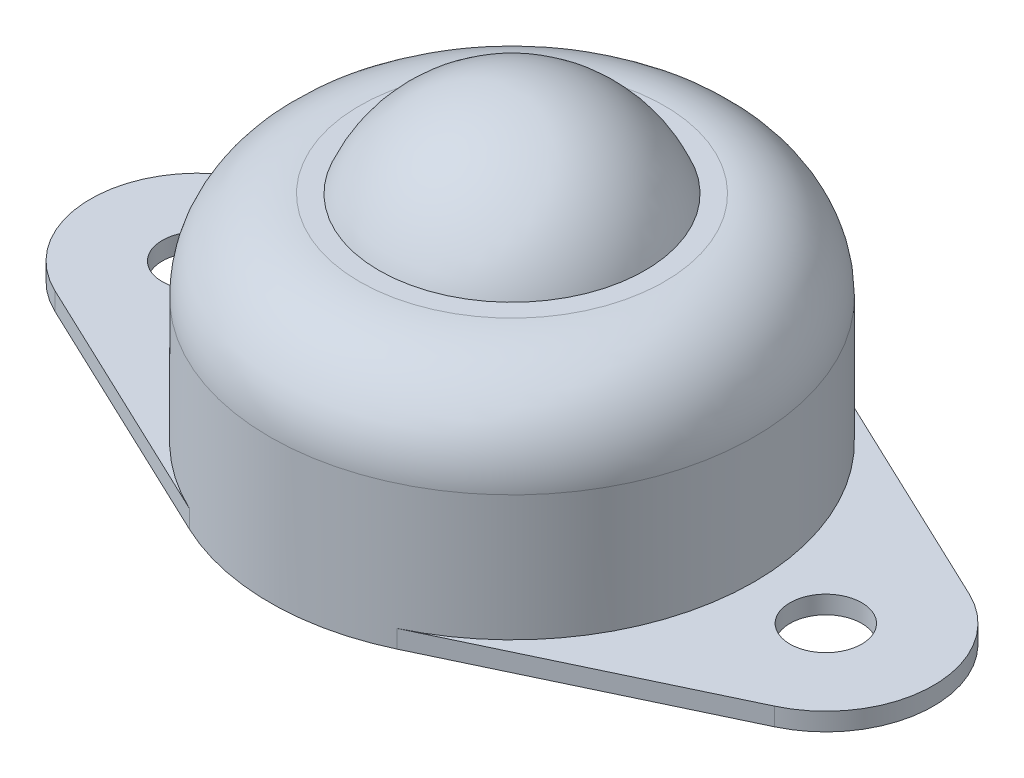
ISO-10303-21;
HEADER;
FILE_DESCRIPTION(('STEP AP214'),'2;1');
FILE_NAME('part.step','',(''),(''),'','','');
FILE_SCHEMA(('AUTOMOTIVE_DESIGN { 1 0 10303 214 1 1 1 1 }'));
ENDSEC;
DATA;
#1=APPLICATION_CONTEXT('core data for automotive mechanical design processes');
#2=APPLICATION_PROTOCOL_DEFINITION('international standard','automotive_design',2000,#1);
#3=PRODUCT_CONTEXT('',#1,'mechanical');
#4=PRODUCT('Part','Part','',(#3));
#5=PRODUCT_RELATED_PRODUCT_CATEGORY('part','',(#4));
#6=PRODUCT_DEFINITION_FORMATION('','',#4);
#7=PRODUCT_DEFINITION_CONTEXT('part definition',#1,'design');
#8=PRODUCT_DEFINITION('design','',#6,#7);
#9=PRODUCT_DEFINITION_SHAPE('','',#8);
#10=(LENGTH_UNIT() NAMED_UNIT(*) SI_UNIT(.MILLI.,.METRE.));
#11=(NAMED_UNIT(*) PLANE_ANGLE_UNIT() SI_UNIT($,.RADIAN.));
#12=(NAMED_UNIT(*) SI_UNIT($,.STERADIAN.) SOLID_ANGLE_UNIT());
#13=UNCERTAINTY_MEASURE_WITH_UNIT(LENGTH_MEASURE(1.E-05),#10,'distance_accuracy_value','');
#14=(GEOMETRIC_REPRESENTATION_CONTEXT(3) GLOBAL_UNCERTAINTY_ASSIGNED_CONTEXT((#13)) GLOBAL_UNIT_ASSIGNED_CONTEXT((#10,
#11,#12)) REPRESENTATION_CONTEXT('',''));
#15=CARTESIAN_POINT('',(0.,0.,0.));
#16=DIRECTION('',(0.,0.,1.));
#17=DIRECTION('',(1.,0.,0.));
#18=AXIS2_PLACEMENT_3D('',#15,#16,#17);
#19=CARTESIAN_POINT('',(-17.5,1.,0.));
#20=DIRECTION('',(0.,1.,0.));
#21=DIRECTION('',(0.,0.,1.));
#22=AXIS2_PLACEMENT_3D('',#19,#20,#21);
#23=PLANE('',#22);
#24=CARTESIAN_POINT('',(17.5,1.,0.));
#25=DIRECTION('',(0.,1.,0.));
#26=DIRECTION('',(0.,0.,1.));
#27=AXIS2_PLACEMENT_3D('',#24,#25,#26);
#28=CIRCLE('',#27,2.);
#29=CARTESIAN_POINT('',(17.5,1.,2.));
#30=VERTEX_POINT('',#29);
#31=EDGE_CURVE('E148',#30,#30,#28,.T.);
#32=ORIENTED_EDGE('',*,*,#31,.F.);
#33=EDGE_LOOP('',(#32));
#34=FACE_BOUND('',#33,.T.);
#35=CARTESIAN_POINT('',(0.,1.,0.));
#36=DIRECTION('',(0.,1.,0.));
#37=DIRECTION('',(0.,0.,1.));
#38=AXIS2_PLACEMENT_3D('',#35,#36,#37);
#39=CIRCLE('',#38,13.5);
#40=CARTESIAN_POINT('',(5.78571428571429,1.,12.1973566892209));
#41=VERTEX_POINT('',#40);
#42=CARTESIAN_POINT('',(5.78571428571428,1.,-12.1973566892209));
#43=VERTEX_POINT('',#42);
#44=EDGE_CURVE('E122',#41,#43,#39,.T.);
#45=ORIENTED_EDGE('',*,*,#44,.F.);
#46=DIRECTION('',(0.903507902905251,0.,-0.428571428571429));
#47=VECTOR('',#46,1.);
#48=CARTESIAN_POINT('',(20.0714285714286,1.,5.4210474174315));
#49=LINE('',#48,#47);
#50=CARTESIAN_POINT('',(20.0714285714286,1.,5.42104741743151));
#51=VERTEX_POINT('',#50);
#52=EDGE_CURVE('E233',#41,#51,#49,.T.);
#53=ORIENTED_EDGE('',*,*,#52,.T.);
#54=CARTESIAN_POINT('',(17.5,1.,0.));
#55=DIRECTION('',(0.,1.,0.));
#56=DIRECTION('',(0.,0.,-1.));
#57=AXIS2_PLACEMENT_3D('',#54,#55,#56);
#58=CIRCLE('',#57,6.);
#59=CARTESIAN_POINT('',(20.0714285714286,1.,-5.42104741743152));
#60=VERTEX_POINT('',#59);
#61=EDGE_CURVE('E124',#51,#60,#58,.T.);
#62=ORIENTED_EDGE('',*,*,#61,.T.);
#63=DIRECTION('',(-0.903507902905252,0.,-0.428571428571428));
#64=VECTOR('',#63,1.);
#65=CARTESIAN_POINT('',(20.0714285714286,1.,-5.42104741743152));
#66=LINE('',#65,#64);
#67=EDGE_CURVE('E119',#60,#43,#66,.T.);
#68=ORIENTED_EDGE('',*,*,#67,.T.);
#69=EDGE_LOOP('',(#45,#53,#62,#68));
#70=FACE_BOUND('',#69,.T.);
#71=ADVANCED_FACE('F44',(#34,#70),#23,.T.);
#72=CARTESIAN_POINT('',(-17.5,1.,0.));
#73=DIRECTION('',(0.,-1.,0.));
#74=DIRECTION('',(0.,0.,-1.));
#75=AXIS2_PLACEMENT_3D('',#72,#73,#74);
#76=CYLINDRICAL_SURFACE('',#75,6.);
#77=CARTESIAN_POINT('',(-17.5,0.,0.));
#78=DIRECTION('',(0.,1.,0.));
#79=DIRECTION('',(0.,0.,1.));
#80=AXIS2_PLACEMENT_3D('',#77,#78,#79);
#81=CIRCLE('',#80,6.);
#82=CARTESIAN_POINT('',(-20.0714285714286,0.,-5.42104741743151));
#83=VERTEX_POINT('',#82);
#84=CARTESIAN_POINT('',(-20.0714285714286,0.,5.42104741743151));
#85=VERTEX_POINT('',#84);
#86=EDGE_CURVE('E140',#83,#85,#81,.T.);
#87=ORIENTED_EDGE('',*,*,#86,.T.);
#88=DIRECTION('',(0.,-1.,0.));
#89=VECTOR('',#88,1.);
#90=CARTESIAN_POINT('',(-20.0714285714286,1.,5.42104741743151));
#91=LINE('',#90,#89);
#92=CARTESIAN_POINT('',(-20.0714285714286,1.,5.42104741743151));
#93=VERTEX_POINT('',#92);
#94=EDGE_CURVE('E153',#93,#85,#91,.T.);
#95=ORIENTED_EDGE('',*,*,#94,.F.);
#96=CARTESIAN_POINT('',(-17.5,1.,0.));
#97=DIRECTION('',(0.,1.,0.));
#98=DIRECTION('',(0.,0.,1.));
#99=AXIS2_PLACEMENT_3D('',#96,#97,#98);
#100=CIRCLE('',#99,6.);
#101=CARTESIAN_POINT('',(-20.0714285714286,1.,-5.42104741743151));
#102=VERTEX_POINT('',#101);
#103=EDGE_CURVE('E223',#102,#93,#100,.T.);
#104=ORIENTED_EDGE('',*,*,#103,.F.);
#105=DIRECTION('',(0.,-1.,0.));
#106=VECTOR('',#105,1.);
#107=CARTESIAN_POINT('',(-20.0714285714286,1.,-5.42104741743151));
#108=LINE('',#107,#106);
#109=EDGE_CURVE('E207',#102,#83,#108,.T.);
#110=ORIENTED_EDGE('',*,*,#109,.T.);
#111=EDGE_LOOP('',(#87,#95,#104,#110));
#112=FACE_BOUND('',#111,.T.);
#113=ADVANCED_FACE('F184',(#112),#76,.T.);
#114=CARTESIAN_POINT('',(-20.0714285714286,1.,5.42104741743151));
#115=DIRECTION('',(0.428571428571428,0.,-0.903507902905251));
#116=DIRECTION('',(-0.903507902905251,0.,-0.428571428571429));
#117=AXIS2_PLACEMENT_3D('',#114,#115,#116);
#118=PLANE('',#117);
#119=DIRECTION('',(0.903507902905251,0.,0.428571428571429));
#120=VECTOR('',#119,1.);
#121=CARTESIAN_POINT('',(-20.0714285714286,0.,5.42104741743151));
#122=LINE('',#121,#120);
#123=CARTESIAN_POINT('',(-5.78571428571429,0.,12.1973566892209));
#124=VERTEX_POINT('',#123);
#125=EDGE_CURVE('E145',#85,#124,#122,.T.);
#126=ORIENTED_EDGE('',*,*,#125,.T.);
#127=DIRECTION('',(0.,-1.,0.));
#128=VECTOR('',#127,1.);
#129=CARTESIAN_POINT('',(-5.78571428571429,1.,12.1973566892209));
#130=LINE('',#129,#128);
#131=CARTESIAN_POINT('',(-5.78571428571429,1.,12.1973566892209));
#132=VERTEX_POINT('',#131);
#133=EDGE_CURVE('E157',#132,#124,#130,.T.);
#134=ORIENTED_EDGE('',*,*,#133,.F.);
#135=DIRECTION('',(0.903507902905251,0.,0.428571428571429));
#136=VECTOR('',#135,1.);
#137=CARTESIAN_POINT('',(-20.0714285714286,1.,5.42104741743151));
#138=LINE('',#137,#136);
#139=EDGE_CURVE('E106',#93,#132,#138,.T.);
#140=ORIENTED_EDGE('',*,*,#139,.F.);
#141=ORIENTED_EDGE('',*,*,#94,.T.);
#142=EDGE_LOOP('',(#126,#134,#140,#141));
#143=FACE_BOUND('',#142,.T.);
#144=ADVANCED_FACE('F192',(#143),#118,.F.);
#145=CARTESIAN_POINT('',(20.0714285714286,1.,5.4210474174315));
#146=DIRECTION('',(-0.428571428571429,0.,-0.903507902905251));
#147=DIRECTION('',(-0.903507902905251,0.,0.428571428571429));
#148=AXIS2_PLACEMENT_3D('',#145,#146,#147);
#149=PLANE('',#148);
#150=DIRECTION('',(0.903507902905251,0.,-0.428571428571429));
#151=VECTOR('',#150,1.);
#152=CARTESIAN_POINT('',(20.0714285714286,0.,5.4210474174315));
#153=LINE('',#152,#151);
#154=CARTESIAN_POINT('',(5.78571428571429,0.,12.1973566892209));
#155=VERTEX_POINT('',#154);
#156=CARTESIAN_POINT('',(20.0714285714286,0.,5.42104741743151));
#157=VERTEX_POINT('',#156);
#158=EDGE_CURVE('E217',#155,#157,#153,.T.);
#159=ORIENTED_EDGE('',*,*,#158,.T.);
#160=DIRECTION('',(0.,-1.,0.));
#161=VECTOR('',#160,1.);
#162=CARTESIAN_POINT('',(20.0714285714286,1.,5.42104741743151));
#163=LINE('',#162,#161);
#164=EDGE_CURVE('E226',#51,#157,#163,.T.);
#165=ORIENTED_EDGE('',*,*,#164,.F.);
#166=ORIENTED_EDGE('',*,*,#52,.F.);
#167=DIRECTION('',(0.,-1.,0.));
#168=VECTOR('',#167,1.);
#169=CARTESIAN_POINT('',(5.78571428571429,1.,12.1973566892209));
#170=LINE('',#169,#168);
#171=EDGE_CURVE('E139',#41,#155,#170,.T.);
#172=ORIENTED_EDGE('',*,*,#171,.T.);
#173=EDGE_LOOP('',(#159,#165,#166,#172));
#174=FACE_BOUND('',#173,.T.);
#175=ADVANCED_FACE('F231',(#174),#149,.F.);
#176=CARTESIAN_POINT('',(17.5,1.,0.));
#177=DIRECTION('',(0.,-1.,0.));
#178=DIRECTION('',(0.,0.,-1.));
#179=AXIS2_PLACEMENT_3D('',#176,#177,#178);
#180=CYLINDRICAL_SURFACE('',#179,6.);
#181=CARTESIAN_POINT('',(17.5,0.,0.));
#182=DIRECTION('',(0.,1.,0.));
#183=DIRECTION('',(0.,0.,-1.));
#184=AXIS2_PLACEMENT_3D('',#181,#182,#183);
#185=CIRCLE('',#184,6.);
#186=CARTESIAN_POINT('',(20.0714285714286,0.,-5.42104741743152));
#187=VERTEX_POINT('',#186);
#188=EDGE_CURVE('E219',#157,#187,#185,.T.);
#189=ORIENTED_EDGE('',*,*,#188,.T.);
#190=DIRECTION('',(0.,-1.,0.));
#191=VECTOR('',#190,1.);
#192=CARTESIAN_POINT('',(20.0714285714286,1.,-5.42104741743152));
#193=LINE('',#192,#191);
#194=EDGE_CURVE('E133',#60,#187,#193,.T.);
#195=ORIENTED_EDGE('',*,*,#194,.F.);
#196=ORIENTED_EDGE('',*,*,#61,.F.);
#197=ORIENTED_EDGE('',*,*,#164,.T.);
#198=EDGE_LOOP('',(#189,#195,#196,#197));
#199=FACE_BOUND('',#198,.T.);
#200=ADVANCED_FACE('F239',(#199),#180,.T.);
#201=CARTESIAN_POINT('',(20.0714285714286,1.,-5.42104741743152));
#202=DIRECTION('',(-0.428571428571428,0.,0.903507902905251));
#203=DIRECTION('',(0.903507902905252,0.,0.428571428571428));
#204=AXIS2_PLACEMENT_3D('',#201,#202,#203);
#205=PLANE('',#204);
#206=DIRECTION('',(-0.903507902905252,0.,-0.428571428571428));
#207=VECTOR('',#206,1.);
#208=CARTESIAN_POINT('',(20.0714285714286,0.,-5.42104741743152));
#209=LINE('',#208,#207);
#210=CARTESIAN_POINT('',(5.78571428571428,0.,-12.1973566892209));
#211=VERTEX_POINT('',#210);
#212=EDGE_CURVE('E132',#187,#211,#209,.T.);
#213=ORIENTED_EDGE('',*,*,#212,.T.);
#214=DIRECTION('',(0.,-1.,0.));
#215=VECTOR('',#214,1.);
#216=CARTESIAN_POINT('',(5.78571428571428,1.,-12.1973566892209));
#217=LINE('',#216,#215);
#218=EDGE_CURVE('E129',#43,#211,#217,.T.);
#219=ORIENTED_EDGE('',*,*,#218,.F.);
#220=ORIENTED_EDGE('',*,*,#67,.F.);
#221=ORIENTED_EDGE('',*,*,#194,.T.);
#222=EDGE_LOOP('',(#213,#219,#220,#221));
#223=FACE_BOUND('',#222,.T.);
#224=ADVANCED_FACE('F130',(#223),#205,.F.);
#225=CARTESIAN_POINT('',(0.,1.,0.));
#226=DIRECTION('',(0.,-1.,0.));
#227=DIRECTION('',(0.,0.,-1.));
#228=AXIS2_PLACEMENT_3D('',#225,#226,#227);
#229=CYLINDRICAL_SURFACE('',#228,13.5);
#230=CARTESIAN_POINT('',(0.,8.,0.));
#231=DIRECTION('',(0.,1.,0.));
#232=DIRECTION('',(0.,0.,1.));
#233=AXIS2_PLACEMENT_3D('',#230,#231,#232);
#234=CIRCLE('',#233,13.5);
#235=CARTESIAN_POINT('',(0.,8.,13.5));
#236=VERTEX_POINT('',#235);
#237=EDGE_CURVE('E11',#236,#236,#234,.F.);
#238=ORIENTED_EDGE('',*,*,#237,.T.);
#239=EDGE_LOOP('',(#238));
#240=FACE_BOUND('',#239,.T.);
#241=CARTESIAN_POINT('',(0.,0.,0.));
#242=DIRECTION('',(0.,1.,0.));
#243=DIRECTION('',(0.,0.,1.));
#244=AXIS2_PLACEMENT_3D('',#241,#242,#243);
#245=CIRCLE('',#244,13.5);
#246=CARTESIAN_POINT('',(-5.78571428571428,0.,-12.1973566892209));
#247=VERTEX_POINT('',#246);
#248=EDGE_CURVE('E91',#211,#247,#245,.T.);
#249=ORIENTED_EDGE('',*,*,#248,.T.);
#250=DIRECTION('',(0.,-1.,0.));
#251=VECTOR('',#250,1.);
#252=CARTESIAN_POINT('',(-5.78571428571428,1.,-12.1973566892209));
#253=LINE('',#252,#251);
#254=CARTESIAN_POINT('',(-5.78571428571428,1.,-12.1973566892209));
#255=VERTEX_POINT('',#254);
#256=EDGE_CURVE('E134',#255,#247,#253,.T.);
#257=ORIENTED_EDGE('',*,*,#256,.F.);
#258=EDGE_CURVE('E143',#255,#132,#39,.T.);
#259=ORIENTED_EDGE('',*,*,#258,.T.);
#260=ORIENTED_EDGE('',*,*,#133,.T.);
#261=CARTESIAN_POINT('',(0.,0.,0.));
#262=DIRECTION('',(0.,1.,0.));
#263=DIRECTION('',(0.,0.,-1.));
#264=AXIS2_PLACEMENT_3D('',#261,#262,#263);
#265=CIRCLE('',#264,13.5);
#266=EDGE_CURVE('E215',#124,#155,#265,.T.);
#267=ORIENTED_EDGE('',*,*,#266,.T.);
#268=ORIENTED_EDGE('',*,*,#171,.F.);
#269=ORIENTED_EDGE('',*,*,#44,.T.);
#270=ORIENTED_EDGE('',*,*,#218,.T.);
#271=EDGE_LOOP('',(#249,#257,#259,#260,#267,#268,#269,#270));
#272=FACE_BOUND('',#271,.T.);
#273=ADVANCED_FACE('F137',(#240,#272),#229,.T.);
#274=CARTESIAN_POINT('',(-20.0714285714286,1.,-5.42104741743151));
#275=DIRECTION('',(0.428571428571428,0.,0.903507902905251));
#276=DIRECTION('',(0.903507902905251,0.,-0.428571428571428));
#277=AXIS2_PLACEMENT_3D('',#274,#275,#276);
#278=PLANE('',#277);
#279=DIRECTION('',(-0.903507902905251,0.,0.428571428571428));
#280=VECTOR('',#279,1.);
#281=CARTESIAN_POINT('',(-20.0714285714286,0.,-5.42104741743151));
#282=LINE('',#281,#280);
#283=EDGE_CURVE('E97',#247,#83,#282,.T.);
#284=ORIENTED_EDGE('',*,*,#283,.T.);
#285=ORIENTED_EDGE('',*,*,#109,.F.);
#286=DIRECTION('',(-0.903507902905251,0.,0.428571428571428));
#287=VECTOR('',#286,1.);
#288=CARTESIAN_POINT('',(-20.0714285714286,1.,-5.42104741743151));
#289=LINE('',#288,#287);
#290=EDGE_CURVE('E61',#255,#102,#289,.T.);
#291=ORIENTED_EDGE('',*,*,#290,.F.);
#292=ORIENTED_EDGE('',*,*,#256,.T.);
#293=EDGE_LOOP('',(#284,#285,#291,#292));
#294=FACE_BOUND('',#293,.T.);
#295=ADVANCED_FACE('F198',(#294),#278,.F.);
#296=CARTESIAN_POINT('',(-17.5,1.,0.));
#297=DIRECTION('',(0.,1.,0.));
#298=DIRECTION('',(0.,0.,1.));
#299=AXIS2_PLACEMENT_3D('',#296,#297,#298);
#300=CIRCLE('',#299,2.);
#301=CARTESIAN_POINT('',(-17.5,1.,2.));
#302=VERTEX_POINT('',#301);
#303=EDGE_CURVE('E141',#302,#302,#300,.T.);
#304=ORIENTED_EDGE('',*,*,#303,.F.);
#305=EDGE_LOOP('',(#304));
#306=FACE_BOUND('',#305,.T.);
#307=ORIENTED_EDGE('',*,*,#258,.F.);
#308=ORIENTED_EDGE('',*,*,#290,.T.);
#309=ORIENTED_EDGE('',*,*,#103,.T.);
#310=ORIENTED_EDGE('',*,*,#139,.T.);
#311=EDGE_LOOP('',(#307,#308,#309,#310));
#312=FACE_BOUND('',#311,.T.);
#313=ADVANCED_FACE('F187',(#306,#312),#23,.T.);
#314=CARTESIAN_POINT('',(-17.5,0.,0.));
#315=DIRECTION('',(0.,1.,0.));
#316=DIRECTION('',(0.,0.,1.));
#317=AXIS2_PLACEMENT_3D('',#314,#315,#316);
#318=PLANE('',#317);
#319=CARTESIAN_POINT('',(-17.5,0.,0.));
#320=DIRECTION('',(0.,-1.,0.));
#321=DIRECTION('',(0.,0.,-1.));
#322=AXIS2_PLACEMENT_3D('',#319,#320,#321);
#323=CIRCLE('',#322,2.);
#324=CARTESIAN_POINT('',(-17.5,0.,-2.));
#325=VERTEX_POINT('',#324);
#326=EDGE_CURVE('E294',#325,#325,#323,.T.);
#327=ORIENTED_EDGE('',*,*,#326,.F.);
#328=EDGE_LOOP('',(#327));
#329=FACE_BOUND('',#328,.T.);
#330=CARTESIAN_POINT('',(17.5,0.,0.));
#331=DIRECTION('',(0.,-1.,0.));
#332=DIRECTION('',(0.,0.,-1.));
#333=AXIS2_PLACEMENT_3D('',#330,#331,#332);
#334=CIRCLE('',#333,2.);
#335=CARTESIAN_POINT('',(17.5,0.,-2.00000000000001));
#336=VERTEX_POINT('',#335);
#337=EDGE_CURVE('E295',#336,#336,#334,.T.);
#338=ORIENTED_EDGE('',*,*,#337,.F.);
#339=EDGE_LOOP('',(#338));
#340=FACE_BOUND('',#339,.T.);
#341=ORIENTED_EDGE('',*,*,#86,.F.);
#342=ORIENTED_EDGE('',*,*,#283,.F.);
#343=ORIENTED_EDGE('',*,*,#248,.F.);
#344=ORIENTED_EDGE('',*,*,#212,.F.);
#345=ORIENTED_EDGE('',*,*,#188,.F.);
#346=ORIENTED_EDGE('',*,*,#158,.F.);
#347=ORIENTED_EDGE('',*,*,#266,.F.);
#348=ORIENTED_EDGE('',*,*,#125,.F.);
#349=EDGE_LOOP('',(#341,#342,#343,#344,#345,#346,#347,#348));
#350=FACE_BOUND('',#349,.T.);
#351=ADVANCED_FACE('F197',(#329,#340,#350),#318,.F.);
#352=CARTESIAN_POINT('',(0.,13.,0.));
#353=DIRECTION('',(0.,1.,0.));
#354=DIRECTION('',(0.,0.,1.));
#355=AXIS2_PLACEMENT_3D('',#352,#353,#354);
#356=PLANE('',#355);
#357=CARTESIAN_POINT('',(0.,13.,0.));
#358=DIRECTION('',(0.,1.,0.));
#359=DIRECTION('',(0.,0.,1.));
#360=AXIS2_PLACEMENT_3D('',#357,#358,#359);
#361=CIRCLE('',#360,8.5);
#362=CARTESIAN_POINT('',(0.,13.,8.5));
#363=VERTEX_POINT('',#362);
#364=EDGE_CURVE('E53',#363,#363,#361,.T.);
#365=ORIENTED_EDGE('',*,*,#364,.T.);
#366=EDGE_LOOP('',(#365));
#367=FACE_BOUND('',#366,.T.);
#368=CARTESIAN_POINT('',(0.,13.,0.));
#369=DIRECTION('',(0.,1.,0.));
#370=DIRECTION('',(0.,0.,1.));
#371=AXIS2_PLACEMENT_3D('',#368,#369,#370);
#372=CIRCLE('',#371,7.41619848709566);
#373=CARTESIAN_POINT('',(0.,13.,7.41619848709566));
#374=VERTEX_POINT('',#373);
#375=EDGE_CURVE('E152',#374,#374,#372,.T.);
#376=ORIENTED_EDGE('',*,*,#375,.F.);
#377=EDGE_LOOP('',(#376));
#378=FACE_BOUND('',#377,.T.);
#379=ADVANCED_FACE('F165',(#367,#378),#356,.T.);
#380=CARTESIAN_POINT('',(0.,10.,0.));
#381=DIRECTION('',(0.,1.,0.));
#382=DIRECTION('',(0.,0.,-1.));
#383=AXIS2_PLACEMENT_3D('',#380,#381,#382);
#384=SPHERICAL_SURFACE('',#383,8.);
#385=ORIENTED_EDGE('',*,*,#375,.T.);
#386=EDGE_LOOP('',(#385));
#387=FACE_BOUND('',#386,.T.);
#388=ADVANCED_FACE('F170',(#387),#384,.T.);
#389=CARTESIAN_POINT('',(0.,8.,0.));
#390=DIRECTION('',(0.,1.,0.));
#391=DIRECTION('',(0.,0.,1.));
#392=AXIS2_PLACEMENT_3D('',#389,#390,#391);
#393=TOROIDAL_SURFACE('',#392,8.5,5.);
#394=ORIENTED_EDGE('',*,*,#237,.F.);
#395=EDGE_LOOP('',(#394));
#396=FACE_BOUND('',#395,.T.);
#397=ORIENTED_EDGE('',*,*,#364,.F.);
#398=EDGE_LOOP('',(#397));
#399=FACE_BOUND('',#398,.T.);
#400=ADVANCED_FACE('F46',(#396,#399),#393,.T.);
#401=CARTESIAN_POINT('',(17.5,18.,0.));
#402=DIRECTION('',(0.,-1.,0.));
#403=DIRECTION('',(0.,0.,-1.));
#404=AXIS2_PLACEMENT_3D('',#401,#402,#403);
#405=CYLINDRICAL_SURFACE('',#404,2.);
#406=ORIENTED_EDGE('',*,*,#31,.T.);
#407=EDGE_LOOP('',(#406));
#408=FACE_BOUND('',#407,.T.);
#409=ORIENTED_EDGE('',*,*,#337,.T.);
#410=EDGE_LOOP('',(#409));
#411=FACE_BOUND('',#410,.T.);
#412=ADVANCED_FACE('F169',(#408,#411),#405,.F.);
#413=CARTESIAN_POINT('',(-17.5,18.,0.));
#414=DIRECTION('',(0.,-1.,0.));
#415=DIRECTION('',(0.,0.,-1.));
#416=AXIS2_PLACEMENT_3D('',#413,#414,#415);
#417=CYLINDRICAL_SURFACE('',#416,2.);
#418=ORIENTED_EDGE('',*,*,#303,.T.);
#419=EDGE_LOOP('',(#418));
#420=FACE_BOUND('',#419,.T.);
#421=ORIENTED_EDGE('',*,*,#326,.T.);
#422=EDGE_LOOP('',(#421));
#423=FACE_BOUND('',#422,.T.);
#424=ADVANCED_FACE('F177',(#420,#423),#417,.F.);
#425=CLOSED_SHELL('',(#71,#113,#144,#175,#200,#224,#273,#295,#313,#351,#379,#388,#400,#412,#424));
#426=MANIFOLD_SOLID_BREP('B2',#425);
#427=ADVANCED_BREP_SHAPE_REPRESENTATION('',(#18,#426),#14);
#428=SHAPE_DEFINITION_REPRESENTATION(#9,#427);
ENDSEC;
END-ISO-10303-21;
